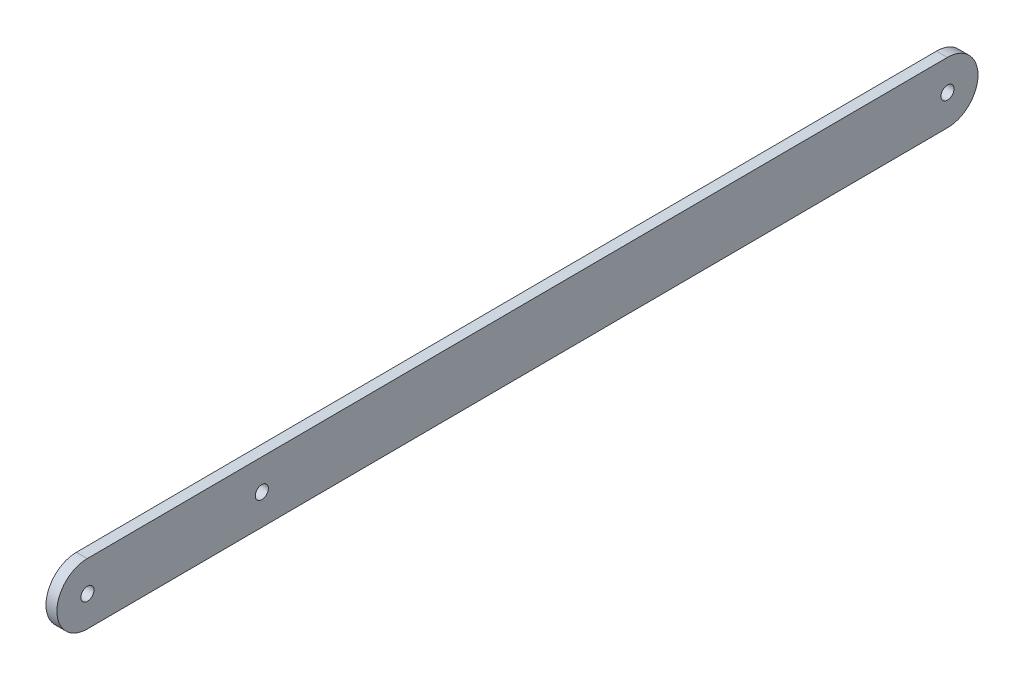
ISO-10303-21;
HEADER;
FILE_DESCRIPTION(('STEP AP214'),'2;1');
FILE_NAME('part.step','',(''),(''),'','','');
FILE_SCHEMA(('AUTOMOTIVE_DESIGN { 1 0 10303 214 1 1 1 1 }'));
ENDSEC;
DATA;
#1=APPLICATION_CONTEXT('core data for automotive mechanical design processes');
#2=APPLICATION_PROTOCOL_DEFINITION('international standard','automotive_design',2000,#1);
#3=PRODUCT_CONTEXT('',#1,'mechanical');
#4=PRODUCT('Part','Part','',(#3));
#5=PRODUCT_RELATED_PRODUCT_CATEGORY('part','',(#4));
#6=PRODUCT_DEFINITION_FORMATION('','',#4);
#7=PRODUCT_DEFINITION_CONTEXT('part definition',#1,'design');
#8=PRODUCT_DEFINITION('design','',#6,#7);
#9=PRODUCT_DEFINITION_SHAPE('','',#8);
#10=(LENGTH_UNIT() NAMED_UNIT(*) SI_UNIT(.MILLI.,.METRE.));
#11=(NAMED_UNIT(*) PLANE_ANGLE_UNIT() SI_UNIT($,.RADIAN.));
#12=(NAMED_UNIT(*) SI_UNIT($,.STERADIAN.) SOLID_ANGLE_UNIT());
#13=UNCERTAINTY_MEASURE_WITH_UNIT(LENGTH_MEASURE(1.E-05),#10,'distance_accuracy_value','');
#14=(GEOMETRIC_REPRESENTATION_CONTEXT(3) GLOBAL_UNCERTAINTY_ASSIGNED_CONTEXT((#13)) GLOBAL_UNIT_ASSIGNED_CONTEXT((#10,
#11,#12)) REPRESENTATION_CONTEXT('',''));
#15=CARTESIAN_POINT('',(0.,0.,0.));
#16=DIRECTION('',(0.,0.,1.));
#17=DIRECTION('',(1.,0.,0.));
#18=AXIS2_PLACEMENT_3D('',#15,#16,#17);
#19=CARTESIAN_POINT('',(2.5,0.91298110296954,0.));
#20=DIRECTION('',(1.,0.,0.));
#21=DIRECTION('',(0.,0.,-1.));
#22=AXIS2_PLACEMENT_3D('',#19,#20,#21);
#23=PLANE('',#22);
#24=CARTESIAN_POINT('',(2.5,0.91298110296954,0.));
#25=DIRECTION('',(1.,0.,0.));
#26=DIRECTION('',(0.,0.,-1.));
#27=AXIS2_PLACEMENT_3D('',#24,#25,#26);
#28=CIRCLE('',#27,1.500000048);
#29=CARTESIAN_POINT('',(2.5,0.91298110296954,-1.500000048));
#30=VERTEX_POINT('',#29);
#31=EDGE_CURVE('E118',#30,#30,#28,.T.);
#32=ORIENTED_EDGE('',*,*,#31,.F.);
#33=EDGE_LOOP('',(#32));
#34=FACE_BOUND('',#33,.T.);
#35=CARTESIAN_POINT('',(2.5,0.91298110296954,0.));
#36=DIRECTION('',(1.,0.,0.));
#37=DIRECTION('',(0.,0.,-1.));
#38=AXIS2_PLACEMENT_3D('',#35,#36,#37);
#39=CIRCLE('',#38,7.);
#40=CARTESIAN_POINT('',(2.5,-6.08694393893783,-0.0323945624770108));
#41=VERTEX_POINT('',#40);
#42=CARTESIAN_POINT('',(2.5,7.91290614487691,0.0323945624770108));
#43=VERTEX_POINT('',#42);
#44=EDGE_CURVE('E88',#41,#43,#39,.T.);
#45=ORIENTED_EDGE('',*,*,#44,.T.);
#46=DIRECTION('',(0.,-0.00462779463957299,0.999989291701053));
#47=VECTOR('',#46,1.);
#48=CARTESIAN_POINT('',(2.5,7.91290614487691,0.0323945624770108));
#49=LINE('',#48,#47);
#50=CARTESIAN_POINT('',(2.5,6.99992504190737,197.312394562477));
#51=VERTEX_POINT('',#50);
#52=EDGE_CURVE('E83',#43,#51,#49,.T.);
#53=ORIENTED_EDGE('',*,*,#52,.T.);
#54=CARTESIAN_POINT('',(2.5,0.,197.28));
#55=DIRECTION('',(1.,0.,0.));
#56=DIRECTION('',(0.,0.,-1.));
#57=AXIS2_PLACEMENT_3D('',#54,#55,#56);
#58=CIRCLE('',#57,7.);
#59=CARTESIAN_POINT('',(2.5,-6.99992504190737,197.247605437523));
#60=VERTEX_POINT('',#59);
#61=EDGE_CURVE('E86',#51,#60,#58,.T.);
#62=ORIENTED_EDGE('',*,*,#61,.T.);
#63=DIRECTION('',(0.,0.00462779463957297,-0.999989291701053));
#64=VECTOR('',#63,1.);
#65=CARTESIAN_POINT('',(2.5,-6.08694393893783,-0.0323945624770108));
#66=LINE('',#65,#64);
#67=EDGE_CURVE('E53',#60,#41,#66,.T.);
#68=ORIENTED_EDGE('',*,*,#67,.T.);
#69=EDGE_LOOP('',(#45,#53,#62,#68));
#70=FACE_BOUND('',#69,.T.);
#71=CARTESIAN_POINT('',(2.5,0.,197.28));
#72=DIRECTION('',(1.,0.,0.));
#73=DIRECTION('',(0.,0.,-1.));
#74=AXIS2_PLACEMENT_3D('',#71,#72,#73);
#75=CIRCLE('',#74,1.50000004799998);
#76=CARTESIAN_POINT('',(2.5,0.,195.779999952));
#77=VERTEX_POINT('',#76);
#78=EDGE_CURVE('E103',#77,#77,#75,.T.);
#79=ORIENTED_EDGE('',*,*,#78,.F.);
#80=EDGE_LOOP('',(#79));
#81=FACE_BOUND('',#80,.T.);
#82=CARTESIAN_POINT('',(2.5,0.185113767836484,157.28));
#83=DIRECTION('',(1.,0.,0.));
#84=DIRECTION('',(0.,0.,-1.));
#85=AXIS2_PLACEMENT_3D('',#82,#83,#84);
#86=CIRCLE('',#85,1.50000004799998);
#87=CARTESIAN_POINT('',(2.5,0.185113767836484,155.779999952));
#88=VERTEX_POINT('',#87);
#89=EDGE_CURVE('E124',#88,#88,#86,.T.);
#90=ORIENTED_EDGE('',*,*,#89,.F.);
#91=EDGE_LOOP('',(#90));
#92=FACE_BOUND('',#91,.T.);
#93=ADVANCED_FACE('F36',(#34,#70,#81,#92),#23,.T.);
#94=CARTESIAN_POINT('',(0.,0.91298110296954,0.));
#95=DIRECTION('',(1.,0.,0.));
#96=DIRECTION('',(0.,0.,-1.));
#97=AXIS2_PLACEMENT_3D('',#94,#95,#96);
#98=PLANE('',#97);
#99=CARTESIAN_POINT('',(0.,0.91298110296954,0.));
#100=DIRECTION('',(1.,0.,0.));
#101=DIRECTION('',(0.,0.,-1.));
#102=AXIS2_PLACEMENT_3D('',#99,#100,#101);
#103=CIRCLE('',#102,7.);
#104=CARTESIAN_POINT('',(0.,-6.08694393893783,-0.0323945624770108));
#105=VERTEX_POINT('',#104);
#106=CARTESIAN_POINT('',(0.,7.91290614487691,0.0323945624770108));
#107=VERTEX_POINT('',#106);
#108=EDGE_CURVE('E100',#105,#107,#103,.T.);
#109=ORIENTED_EDGE('',*,*,#108,.F.);
#110=DIRECTION('',(0.,0.00462779463957297,-0.999989291701053));
#111=VECTOR('',#110,1.);
#112=CARTESIAN_POINT('',(0.,-6.08694393893783,-0.0323945624770108));
#113=LINE('',#112,#111);
#114=CARTESIAN_POINT('',(0.,-6.99992504190737,197.247605437523));
#115=VERTEX_POINT('',#114);
#116=EDGE_CURVE('E76',#115,#105,#113,.T.);
#117=ORIENTED_EDGE('',*,*,#116,.F.);
#118=CARTESIAN_POINT('',(0.,0.,197.28));
#119=DIRECTION('',(1.,0.,0.));
#120=DIRECTION('',(0.,0.,-1.));
#121=AXIS2_PLACEMENT_3D('',#118,#119,#120);
#122=CIRCLE('',#121,7.);
#123=CARTESIAN_POINT('',(0.,6.99992504190737,197.312394562477));
#124=VERTEX_POINT('',#123);
#125=EDGE_CURVE('E70',#124,#115,#122,.T.);
#126=ORIENTED_EDGE('',*,*,#125,.F.);
#127=DIRECTION('',(0.,-0.00462779463957299,0.999989291701053));
#128=VECTOR('',#127,1.);
#129=CARTESIAN_POINT('',(0.,7.91290614487691,0.0323945624770108));
#130=LINE('',#129,#128);
#131=EDGE_CURVE('E92',#107,#124,#130,.T.);
#132=ORIENTED_EDGE('',*,*,#131,.F.);
#133=EDGE_LOOP('',(#109,#117,#126,#132));
#134=FACE_BOUND('',#133,.T.);
#135=CARTESIAN_POINT('',(0.,0.,197.28));
#136=DIRECTION('',(1.,0.,0.));
#137=DIRECTION('',(0.,0.,-1.));
#138=AXIS2_PLACEMENT_3D('',#135,#136,#137);
#139=CIRCLE('',#138,1.50000004799998);
#140=CARTESIAN_POINT('',(0.,0.,195.779999952));
#141=VERTEX_POINT('',#140);
#142=EDGE_CURVE('E115',#141,#141,#139,.T.);
#143=ORIENTED_EDGE('',*,*,#142,.T.);
#144=EDGE_LOOP('',(#143));
#145=FACE_BOUND('',#144,.T.);
#146=CARTESIAN_POINT('',(0.,0.91298110296954,0.));
#147=DIRECTION('',(1.,0.,0.));
#148=DIRECTION('',(0.,0.,-1.));
#149=AXIS2_PLACEMENT_3D('',#146,#147,#148);
#150=CIRCLE('',#149,1.500000048);
#151=CARTESIAN_POINT('',(0.,0.91298110296954,-1.500000048));
#152=VERTEX_POINT('',#151);
#153=EDGE_CURVE('E121',#152,#152,#150,.T.);
#154=ORIENTED_EDGE('',*,*,#153,.T.);
#155=EDGE_LOOP('',(#154));
#156=FACE_BOUND('',#155,.T.);
#157=CARTESIAN_POINT('',(0.,0.185113767836484,157.28));
#158=DIRECTION('',(1.,0.,0.));
#159=DIRECTION('',(0.,0.,-1.));
#160=AXIS2_PLACEMENT_3D('',#157,#158,#159);
#161=CIRCLE('',#160,1.50000004799998);
#162=CARTESIAN_POINT('',(0.,0.185113767836484,155.779999952));
#163=VERTEX_POINT('',#162);
#164=EDGE_CURVE('E127',#163,#163,#161,.T.);
#165=ORIENTED_EDGE('',*,*,#164,.T.);
#166=EDGE_LOOP('',(#165));
#167=FACE_BOUND('',#166,.T.);
#168=ADVANCED_FACE('F111',(#134,#145,#156,#167),#98,.F.);
#169=CARTESIAN_POINT('',(2.5,0.91298110296954,0.));
#170=DIRECTION('',(-1.,0.,0.));
#171=DIRECTION('',(0.,0.,1.));
#172=AXIS2_PLACEMENT_3D('',#169,#170,#171);
#173=CYLINDRICAL_SURFACE('',#172,7.);
#174=ORIENTED_EDGE('',*,*,#108,.T.);
#175=DIRECTION('',(-1.,0.,0.));
#176=VECTOR('',#175,1.);
#177=CARTESIAN_POINT('',(2.5,7.91290614487691,0.0323945624770108));
#178=LINE('',#177,#176);
#179=EDGE_CURVE('E11',#43,#107,#178,.T.);
#180=ORIENTED_EDGE('',*,*,#179,.F.);
#181=ORIENTED_EDGE('',*,*,#44,.F.);
#182=DIRECTION('',(-1.,0.,0.));
#183=VECTOR('',#182,1.);
#184=CARTESIAN_POINT('',(2.5,-6.08694393893783,-0.0323945624770108));
#185=LINE('',#184,#183);
#186=EDGE_CURVE('E96',#41,#105,#185,.T.);
#187=ORIENTED_EDGE('',*,*,#186,.T.);
#188=EDGE_LOOP('',(#174,#180,#181,#187));
#189=FACE_BOUND('',#188,.T.);
#190=ADVANCED_FACE('F38',(#189),#173,.T.);
#191=CARTESIAN_POINT('',(2.5,7.91290614487691,0.0323945624770108));
#192=DIRECTION('',(0.,-0.999989291701053,-0.00462779463957299));
#193=DIRECTION('',(0.,0.00462779463957299,-0.999989291701053));
#194=AXIS2_PLACEMENT_3D('',#191,#192,#193);
#195=PLANE('',#194);
#196=ORIENTED_EDGE('',*,*,#131,.T.);
#197=DIRECTION('',(-1.,0.,0.));
#198=VECTOR('',#197,1.);
#199=CARTESIAN_POINT('',(2.5,6.99992504190737,197.312394562477));
#200=LINE('',#199,#198);
#201=EDGE_CURVE('E45',#51,#124,#200,.T.);
#202=ORIENTED_EDGE('',*,*,#201,.F.);
#203=ORIENTED_EDGE('',*,*,#52,.F.);
#204=ORIENTED_EDGE('',*,*,#179,.T.);
#205=EDGE_LOOP('',(#196,#202,#203,#204));
#206=FACE_BOUND('',#205,.T.);
#207=ADVANCED_FACE('F91',(#206),#195,.F.);
#208=CARTESIAN_POINT('',(2.5,0.,197.28));
#209=DIRECTION('',(-1.,0.,0.));
#210=DIRECTION('',(0.,0.,1.));
#211=AXIS2_PLACEMENT_3D('',#208,#209,#210);
#212=CYLINDRICAL_SURFACE('',#211,7.);
#213=ORIENTED_EDGE('',*,*,#125,.T.);
#214=DIRECTION('',(-1.,0.,0.));
#215=VECTOR('',#214,1.);
#216=CARTESIAN_POINT('',(2.5,-6.99992504190737,197.247605437523));
#217=LINE('',#216,#215);
#218=EDGE_CURVE('E93',#60,#115,#217,.T.);
#219=ORIENTED_EDGE('',*,*,#218,.F.);
#220=ORIENTED_EDGE('',*,*,#61,.F.);
#221=ORIENTED_EDGE('',*,*,#201,.T.);
#222=EDGE_LOOP('',(#213,#219,#220,#221));
#223=FACE_BOUND('',#222,.T.);
#224=ADVANCED_FACE('F94',(#223),#212,.T.);
#225=CARTESIAN_POINT('',(2.5,-6.08694393893783,-0.0323945624770108));
#226=DIRECTION('',(0.,0.999989291701053,0.00462779463957297));
#227=DIRECTION('',(0.,-0.00462779463957297,0.999989291701053));
#228=AXIS2_PLACEMENT_3D('',#225,#226,#227);
#229=PLANE('',#228);
#230=ORIENTED_EDGE('',*,*,#116,.T.);
#231=ORIENTED_EDGE('',*,*,#186,.F.);
#232=ORIENTED_EDGE('',*,*,#67,.F.);
#233=ORIENTED_EDGE('',*,*,#218,.T.);
#234=EDGE_LOOP('',(#230,#231,#232,#233));
#235=FACE_BOUND('',#234,.T.);
#236=ADVANCED_FACE('F108',(#235),#229,.F.);
#237=CARTESIAN_POINT('',(2.5,0.,197.28));
#238=DIRECTION('',(-1.,0.,0.));
#239=DIRECTION('',(0.,0.,1.));
#240=AXIS2_PLACEMENT_3D('',#237,#238,#239);
#241=CYLINDRICAL_SURFACE('',#240,1.50000004799998);
#242=ORIENTED_EDGE('',*,*,#78,.T.);
#243=EDGE_LOOP('',(#242));
#244=FACE_BOUND('',#243,.T.);
#245=ORIENTED_EDGE('',*,*,#142,.F.);
#246=EDGE_LOOP('',(#245));
#247=FACE_BOUND('',#246,.T.);
#248=ADVANCED_FACE('F145',(#244,#247),#241,.F.);
#249=CARTESIAN_POINT('',(2.5,0.91298110296954,0.));
#250=DIRECTION('',(-1.,0.,0.));
#251=DIRECTION('',(0.,0.,1.));
#252=AXIS2_PLACEMENT_3D('',#249,#250,#251);
#253=CYLINDRICAL_SURFACE('',#252,1.500000048);
#254=ORIENTED_EDGE('',*,*,#31,.T.);
#255=EDGE_LOOP('',(#254));
#256=FACE_BOUND('',#255,.T.);
#257=ORIENTED_EDGE('',*,*,#153,.F.);
#258=EDGE_LOOP('',(#257));
#259=FACE_BOUND('',#258,.T.);
#260=ADVANCED_FACE('F191',(#256,#259),#253,.F.);
#261=CARTESIAN_POINT('',(2.5,0.185113767836484,157.28));
#262=DIRECTION('',(-1.,0.,0.));
#263=DIRECTION('',(0.,0.,1.));
#264=AXIS2_PLACEMENT_3D('',#261,#262,#263);
#265=CYLINDRICAL_SURFACE('',#264,1.50000004799998);
#266=ORIENTED_EDGE('',*,*,#89,.T.);
#267=EDGE_LOOP('',(#266));
#268=FACE_BOUND('',#267,.T.);
#269=ORIENTED_EDGE('',*,*,#164,.F.);
#270=EDGE_LOOP('',(#269));
#271=FACE_BOUND('',#270,.T.);
#272=ADVANCED_FACE('F133',(#268,#271),#265,.F.);
#273=CLOSED_SHELL('',(#93,#168,#190,#207,#224,#236,#248,#260,#272));
#274=MANIFOLD_SOLID_BREP('B2',#273);
#275=ADVANCED_BREP_SHAPE_REPRESENTATION('',(#18,#274),#14);
#276=SHAPE_DEFINITION_REPRESENTATION(#9,#275);
ENDSEC;
END-ISO-10303-21;
